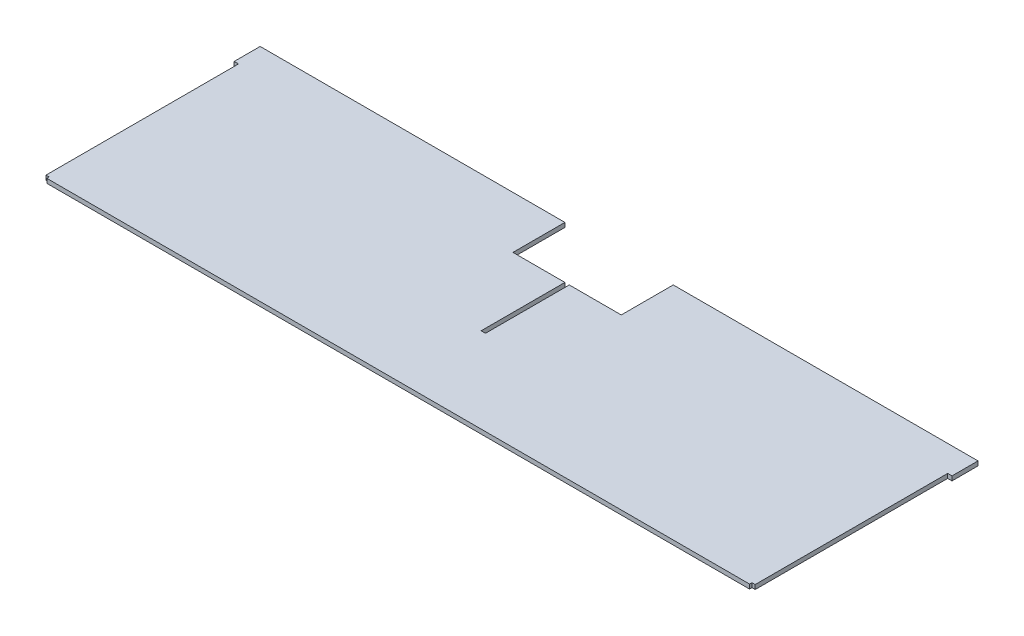
ISO-10303-21;
HEADER;
FILE_DESCRIPTION(('STEP AP214'),'2;1');
FILE_NAME('part.step','',(''),(''),'','','');
FILE_SCHEMA(('AUTOMOTIVE_DESIGN { 1 0 10303 214 1 1 1 1 }'));
ENDSEC;
DATA;
#1=APPLICATION_CONTEXT('core data for automotive mechanical design processes');
#2=APPLICATION_PROTOCOL_DEFINITION('international standard','automotive_design',2000,#1);
#3=PRODUCT_CONTEXT('',#1,'mechanical');
#4=PRODUCT('Part','Part','',(#3));
#5=PRODUCT_RELATED_PRODUCT_CATEGORY('part','',(#4));
#6=PRODUCT_DEFINITION_FORMATION('','',#4);
#7=PRODUCT_DEFINITION_CONTEXT('part definition',#1,'design');
#8=PRODUCT_DEFINITION('design','',#6,#7);
#9=PRODUCT_DEFINITION_SHAPE('','',#8);
#10=(LENGTH_UNIT() NAMED_UNIT(*) SI_UNIT(.MILLI.,.METRE.));
#11=(NAMED_UNIT(*) PLANE_ANGLE_UNIT() SI_UNIT($,.RADIAN.));
#12=(NAMED_UNIT(*) SI_UNIT($,.STERADIAN.) SOLID_ANGLE_UNIT());
#13=UNCERTAINTY_MEASURE_WITH_UNIT(LENGTH_MEASURE(1.E-05),#10,'distance_accuracy_value','');
#14=(GEOMETRIC_REPRESENTATION_CONTEXT(3) GLOBAL_UNCERTAINTY_ASSIGNED_CONTEXT((#13)) GLOBAL_UNIT_ASSIGNED_CONTEXT((#10,
#11,#12)) REPRESENTATION_CONTEXT('',''));
#15=CARTESIAN_POINT('',(0.,0.,0.));
#16=DIRECTION('',(0.,0.,1.));
#17=DIRECTION('',(1.,0.,0.));
#18=AXIS2_PLACEMENT_3D('',#15,#16,#17);
#19=CARTESIAN_POINT('',(-260.999093317,3.2,-99.5000000089999));
#20=DIRECTION('',(0.,0.,1.));
#21=DIRECTION('',(-1.,0.,0.));
#22=AXIS2_PLACEMENT_3D('',#19,#20,#21);
#23=PLANE('',#22);
#24=DIRECTION('',(0.,1.,0.));
#25=VECTOR('',#24,1.);
#26=CARTESIAN_POINT('',(41.7806399840001,0.,-99.500000009));
#27=LINE('',#26,#25);
#28=CARTESIAN_POINT('',(41.7806399840001,0.,-99.500000009));
#29=VERTEX_POINT('',#28);
#30=CARTESIAN_POINT('',(41.7806399840001,3.2,-99.500000009));
#31=VERTEX_POINT('',#30);
#32=EDGE_CURVE('E308',#29,#31,#27,.T.);
#33=ORIENTED_EDGE('',*,*,#32,.T.);
#34=DIRECTION('',(-1.,0.,0.));
#35=VECTOR('',#34,1.);
#36=CARTESIAN_POINT('',(-260.999093317,3.2,-99.5000000089999));
#37=LINE('',#36,#35);
#38=CARTESIAN_POINT('',(265.160373285,3.2,-99.500000009));
#39=VERTEX_POINT('',#38);
#40=EDGE_CURVE('E271',#39,#31,#37,.T.);
#41=ORIENTED_EDGE('',*,*,#40,.F.);
#42=DIRECTION('',(0.,1.,0.));
#43=VECTOR('',#42,1.);
#44=CARTESIAN_POINT('',(265.160373285,3.2,-99.500000009));
#45=LINE('',#44,#43);
#46=CARTESIAN_POINT('',(265.160373285,0.,-99.500000009));
#47=VERTEX_POINT('',#46);
#48=EDGE_CURVE('E220',#47,#39,#45,.T.);
#49=ORIENTED_EDGE('',*,*,#48,.F.);
#50=DIRECTION('',(1.,0.,0.));
#51=VECTOR('',#50,1.);
#52=CARTESIAN_POINT('',(0.,0.,-99.500000009));
#53=LINE('',#52,#51);
#54=EDGE_CURVE('E210',#47,#29,#53,.F.);
#55=ORIENTED_EDGE('',*,*,#54,.T.);
#56=EDGE_LOOP('',(#33,#41,#49,#55));
#57=FACE_BOUND('',#56,.T.);
#58=ADVANCED_FACE('F45',(#57),#23,.F.);
#59=CARTESIAN_POINT('',(-260.999093317,3.2,60.6376266290001));
#60=DIRECTION('',(1.,0.,0.));
#61=DIRECTION('',(0.,0.,1.));
#62=AXIS2_PLACEMENT_3D('',#59,#60,#61);
#63=PLANE('',#62);
#64=DIRECTION('',(0.,1.,0.));
#65=VECTOR('',#64,1.);
#66=CARTESIAN_POINT('',(-260.999093317,0.,-80.452540009));
#67=LINE('',#66,#65);
#68=CARTESIAN_POINT('',(-260.999093317,0.,-80.452540009));
#69=VERTEX_POINT('',#68);
#70=CARTESIAN_POINT('',(-260.999093317,3.2,-80.452540009));
#71=VERTEX_POINT('',#70);
#72=EDGE_CURVE('E312',#69,#71,#67,.T.);
#73=ORIENTED_EDGE('',*,*,#72,.T.);
#74=DIRECTION('',(0.,0.,1.));
#75=VECTOR('',#74,1.);
#76=CARTESIAN_POINT('',(-260.999093317,3.2,60.6376266290001));
#77=LINE('',#76,#75);
#78=CARTESIAN_POINT('',(-260.999093317,3.2,-99.5000000089999));
#79=VERTEX_POINT('',#78);
#80=EDGE_CURVE('E266',#79,#71,#77,.T.);
#81=ORIENTED_EDGE('',*,*,#80,.F.);
#82=DIRECTION('',(0.,1.,0.));
#83=VECTOR('',#82,1.);
#84=CARTESIAN_POINT('',(-260.999093317,3.2,-99.5000000089999));
#85=LINE('',#84,#83);
#86=CARTESIAN_POINT('',(-260.999093317,0.,-99.5000000089999));
#87=VERTEX_POINT('',#86);
#88=EDGE_CURVE('E53',#87,#79,#85,.T.);
#89=ORIENTED_EDGE('',*,*,#88,.F.);
#90=DIRECTION('',(0.,0.,-1.));
#91=VECTOR('',#90,1.);
#92=CARTESIAN_POINT('',(-260.999093317,0.,0.));
#93=LINE('',#92,#91);
#94=EDGE_CURVE('E205',#87,#69,#93,.F.);
#95=ORIENTED_EDGE('',*,*,#94,.T.);
#96=EDGE_LOOP('',(#73,#81,#89,#95));
#97=FACE_BOUND('',#96,.T.);
#98=ADVANCED_FACE('F357',(#97),#63,.F.);
#99=CARTESIAN_POINT('',(-260.999093317,3.2,60.6376266290001));
#100=DIRECTION('',(0.,0.,-1.));
#101=DIRECTION('',(1.,0.,0.));
#102=AXIS2_PLACEMENT_3D('',#99,#100,#101);
#103=PLANE('',#102);
#104=DIRECTION('',(0.,1.,0.));
#105=VECTOR('',#104,1.);
#106=CARTESIAN_POINT('',(-257.824093317,0.,60.6376266290001));
#107=LINE('',#106,#105);
#108=CARTESIAN_POINT('',(-257.824093317,0.,60.6376266290001));
#109=VERTEX_POINT('',#108);
#110=CARTESIAN_POINT('',(-257.824093317,3.2,60.6376266290001));
#111=VERTEX_POINT('',#110);
#112=EDGE_CURVE('E185',#109,#111,#107,.T.);
#113=ORIENTED_EDGE('',*,*,#112,.F.);
#114=DIRECTION('',(1.,0.,0.));
#115=VECTOR('',#114,1.);
#116=CARTESIAN_POINT('',(0.,0.,60.6376266290001));
#117=LINE('',#116,#115);
#118=CARTESIAN_POINT('',(-255.462493265,0.,60.6376266290001));
#119=VERTEX_POINT('',#118);
#120=EDGE_CURVE('E196',#109,#119,#117,.T.);
#121=ORIENTED_EDGE('',*,*,#120,.T.);
#122=DIRECTION('',(0.,1.,0.));
#123=VECTOR('',#122,1.);
#124=CARTESIAN_POINT('',(-255.462493265,3.2,60.6376266290001));
#125=LINE('',#124,#123);
#126=CARTESIAN_POINT('',(-255.462493265,3.2,60.6376266290001));
#127=VERTEX_POINT('',#126);
#128=EDGE_CURVE('E224',#119,#127,#125,.T.);
#129=ORIENTED_EDGE('',*,*,#128,.T.);
#130=DIRECTION('',(1.,0.,0.));
#131=VECTOR('',#130,1.);
#132=CARTESIAN_POINT('',(-260.999093317,3.2,60.6376266290001));
#133=LINE('',#132,#131);
#134=EDGE_CURVE('E198',#111,#127,#133,.T.);
#135=ORIENTED_EDGE('',*,*,#134,.F.);
#136=EDGE_LOOP('',(#113,#121,#129,#135));
#137=FACE_BOUND('',#136,.T.);
#138=ADVANCED_FACE('F194',(#137),#103,.F.);
#139=CARTESIAN_POINT('',(-255.462493265,3.2,60.6376266290001));
#140=DIRECTION('',(1.,0.,0.));
#141=DIRECTION('',(0.,0.,1.));
#142=AXIS2_PLACEMENT_3D('',#139,#140,#141);
#143=PLANE('',#142);
#144=ORIENTED_EDGE('',*,*,#128,.F.);
#145=DIRECTION('',(0.,0.,-1.));
#146=VECTOR('',#145,1.);
#147=CARTESIAN_POINT('',(-255.462493265,0.,0.));
#148=LINE('',#147,#146);
#149=CARTESIAN_POINT('',(-255.462493265,0.,62.4000000410001));
#150=VERTEX_POINT('',#149);
#151=EDGE_CURVE('E204',#119,#150,#148,.F.);
#152=ORIENTED_EDGE('',*,*,#151,.T.);
#153=DIRECTION('',(0.,1.,0.));
#154=VECTOR('',#153,1.);
#155=CARTESIAN_POINT('',(-255.462493265,3.2,62.4000000410001));
#156=LINE('',#155,#154);
#157=CARTESIAN_POINT('',(-255.462493265,3.2,62.4000000410001));
#158=VERTEX_POINT('',#157);
#159=EDGE_CURVE('E222',#150,#158,#156,.T.);
#160=ORIENTED_EDGE('',*,*,#159,.T.);
#161=DIRECTION('',(0.,0.,1.));
#162=VECTOR('',#161,1.);
#163=CARTESIAN_POINT('',(-255.462493265,3.2,60.6376266290001));
#164=LINE('',#163,#162);
#165=EDGE_CURVE('E264',#127,#158,#164,.T.);
#166=ORIENTED_EDGE('',*,*,#165,.F.);
#167=EDGE_LOOP('',(#144,#152,#160,#166));
#168=FACE_BOUND('',#167,.T.);
#169=ADVANCED_FACE('F261',(#168),#143,.F.);
#170=CARTESIAN_POINT('',(-255.462493265,3.2,62.4000000410001));
#171=DIRECTION('',(0.,0.,-1.));
#172=DIRECTION('',(1.,0.,0.));
#173=AXIS2_PLACEMENT_3D('',#170,#171,#172);
#174=PLANE('',#173);
#175=ORIENTED_EDGE('',*,*,#159,.F.);
#176=DIRECTION('',(1.,0.,0.));
#177=VECTOR('',#176,1.);
#178=CARTESIAN_POINT('',(0.,0.,62.4000000410001));
#179=LINE('',#178,#177);
#180=CARTESIAN_POINT('',(259.623773233,0.,62.400000041));
#181=VERTEX_POINT('',#180);
#182=EDGE_CURVE('E207',#150,#181,#179,.T.);
#183=ORIENTED_EDGE('',*,*,#182,.T.);
#184=DIRECTION('',(0.,1.,0.));
#185=VECTOR('',#184,1.);
#186=CARTESIAN_POINT('',(259.623773233,3.2,62.400000041));
#187=LINE('',#186,#185);
#188=CARTESIAN_POINT('',(259.623773233,3.2,62.400000041));
#189=VERTEX_POINT('',#188);
#190=EDGE_CURVE('E219',#181,#189,#187,.T.);
#191=ORIENTED_EDGE('',*,*,#190,.T.);
#192=DIRECTION('',(1.,0.,0.));
#193=VECTOR('',#192,1.);
#194=CARTESIAN_POINT('',(-255.462493265,3.2,62.4000000410001));
#195=LINE('',#194,#193);
#196=EDGE_CURVE('E240',#158,#189,#195,.T.);
#197=ORIENTED_EDGE('',*,*,#196,.F.);
#198=EDGE_LOOP('',(#175,#183,#191,#197));
#199=FACE_BOUND('',#198,.T.);
#200=ADVANCED_FACE('F255',(#199),#174,.F.);
#201=CARTESIAN_POINT('',(259.623773233,3.2,60.637626629));
#202=DIRECTION('',(-1.,0.,0.));
#203=DIRECTION('',(0.,0.,-1.));
#204=AXIS2_PLACEMENT_3D('',#201,#202,#203);
#205=PLANE('',#204);
#206=ORIENTED_EDGE('',*,*,#190,.F.);
#207=DIRECTION('',(0.,0.,-1.));
#208=VECTOR('',#207,1.);
#209=CARTESIAN_POINT('',(259.623773233,0.,0.));
#210=LINE('',#209,#208);
#211=CARTESIAN_POINT('',(259.623773233,0.,60.637626629));
#212=VERTEX_POINT('',#211);
#213=EDGE_CURVE('E251',#181,#212,#210,.T.);
#214=ORIENTED_EDGE('',*,*,#213,.T.);
#215=DIRECTION('',(0.,1.,0.));
#216=VECTOR('',#215,1.);
#217=CARTESIAN_POINT('',(259.623773233,3.2,60.637626629));
#218=LINE('',#217,#216);
#219=CARTESIAN_POINT('',(259.623773233,3.2,60.637626629));
#220=VERTEX_POINT('',#219);
#221=EDGE_CURVE('E217',#212,#220,#218,.T.);
#222=ORIENTED_EDGE('',*,*,#221,.T.);
#223=DIRECTION('',(0.,0.,-1.));
#224=VECTOR('',#223,1.);
#225=CARTESIAN_POINT('',(259.623773233,3.2,60.637626629));
#226=LINE('',#225,#224);
#227=EDGE_CURVE('E234',#189,#220,#226,.T.);
#228=ORIENTED_EDGE('',*,*,#227,.F.);
#229=EDGE_LOOP('',(#206,#214,#222,#228));
#230=FACE_BOUND('',#229,.T.);
#231=ADVANCED_FACE('F403',(#230),#205,.F.);
#232=CARTESIAN_POINT('',(265.160373285,3.2,60.637626629));
#233=DIRECTION('',(0.,0.,-1.));
#234=DIRECTION('',(1.,0.,0.));
#235=AXIS2_PLACEMENT_3D('',#232,#233,#234);
#236=PLANE('',#235);
#237=DIRECTION('',(0.,1.,0.));
#238=VECTOR('',#237,1.);
#239=CARTESIAN_POINT('',(261.985373285,0.,60.637626629));
#240=LINE('',#239,#238);
#241=CARTESIAN_POINT('',(261.985373285,0.,60.637626629));
#242=VERTEX_POINT('',#241);
#243=CARTESIAN_POINT('',(261.985373285,3.2,60.637626629));
#244=VERTEX_POINT('',#243);
#245=EDGE_CURVE('E342',#242,#244,#240,.T.);
#246=ORIENTED_EDGE('',*,*,#245,.T.);
#247=DIRECTION('',(1.,0.,0.));
#248=VECTOR('',#247,1.);
#249=CARTESIAN_POINT('',(265.160373285,3.2,60.637626629));
#250=LINE('',#249,#248);
#251=EDGE_CURVE('E228',#220,#244,#250,.T.);
#252=ORIENTED_EDGE('',*,*,#251,.F.);
#253=ORIENTED_EDGE('',*,*,#221,.F.);
#254=DIRECTION('',(1.,0.,0.));
#255=VECTOR('',#254,1.);
#256=CARTESIAN_POINT('',(0.,0.,60.637626629));
#257=LINE('',#256,#255);
#258=EDGE_CURVE('E247',#212,#242,#257,.T.);
#259=ORIENTED_EDGE('',*,*,#258,.T.);
#260=EDGE_LOOP('',(#246,#252,#253,#259));
#261=FACE_BOUND('',#260,.T.);
#262=ADVANCED_FACE('F400',(#261),#236,.F.);
#263=CARTESIAN_POINT('',(265.160373285,3.2,60.637626629));
#264=DIRECTION('',(-1.,0.,0.));
#265=DIRECTION('',(0.,0.,-1.));
#266=AXIS2_PLACEMENT_3D('',#263,#264,#265);
#267=PLANE('',#266);
#268=DIRECTION('',(0.,1.,0.));
#269=VECTOR('',#268,1.);
#270=CARTESIAN_POINT('',(265.160373285,0.,-80.450254009));
#271=LINE('',#270,#269);
#272=CARTESIAN_POINT('',(265.160373285,0.,-80.450254009));
#273=VERTEX_POINT('',#272);
#274=CARTESIAN_POINT('',(265.160373285,3.2,-80.450254009));
#275=VERTEX_POINT('',#274);
#276=EDGE_CURVE('E336',#273,#275,#271,.T.);
#277=ORIENTED_EDGE('',*,*,#276,.F.);
#278=DIRECTION('',(0.,0.,-1.));
#279=VECTOR('',#278,1.);
#280=CARTESIAN_POINT('',(265.160373285,0.,0.));
#281=LINE('',#280,#279);
#282=EDGE_CURVE('E244',#273,#47,#281,.T.);
#283=ORIENTED_EDGE('',*,*,#282,.T.);
#284=ORIENTED_EDGE('',*,*,#48,.T.);
#285=DIRECTION('',(0.,0.,-1.));
#286=VECTOR('',#285,1.);
#287=CARTESIAN_POINT('',(265.160373285,3.2,60.637626629));
#288=LINE('',#287,#286);
#289=EDGE_CURVE('E250',#275,#39,#288,.T.);
#290=ORIENTED_EDGE('',*,*,#289,.F.);
#291=EDGE_LOOP('',(#277,#283,#284,#290));
#292=FACE_BOUND('',#291,.T.);
#293=ADVANCED_FACE('F394',(#292),#267,.F.);
#294=DIRECTION('',(0.,1.,0.));
#295=VECTOR('',#294,1.);
#296=CARTESIAN_POINT('',(-37.6193600159999,0.,-99.500000009));
#297=LINE('',#296,#295);
#298=CARTESIAN_POINT('',(-37.6193600159999,0.,-99.500000009));
#299=VERTEX_POINT('',#298);
#300=CARTESIAN_POINT('',(-37.6193600159999,3.2,-99.500000009));
#301=VERTEX_POINT('',#300);
#302=EDGE_CURVE('E315',#299,#301,#297,.T.);
#303=ORIENTED_EDGE('',*,*,#302,.F.);
#304=EDGE_CURVE('E216',#299,#87,#53,.F.);
#305=ORIENTED_EDGE('',*,*,#304,.T.);
#306=ORIENTED_EDGE('',*,*,#88,.T.);
#307=EDGE_CURVE('E274',#301,#79,#37,.T.);
#308=ORIENTED_EDGE('',*,*,#307,.F.);
#309=EDGE_LOOP('',(#303,#305,#306,#308));
#310=FACE_BOUND('',#309,.T.);
#311=ADVANCED_FACE('F47',(#310),#23,.F.);
#312=CARTESIAN_POINT('',(0.,3.2,0.));
#313=DIRECTION('',(0.,-1.,0.));
#314=DIRECTION('',(0.,0.,-1.));
#315=AXIS2_PLACEMENT_3D('',#312,#313,#314);
#316=PLANE('',#315);
#317=ORIENTED_EDGE('',*,*,#80,.T.);
#318=DIRECTION('',(-1.,0.,0.));
#319=VECTOR('',#318,1.);
#320=CARTESIAN_POINT('',(-260.999093317,3.2,-80.452540009));
#321=LINE('',#320,#319);
#322=CARTESIAN_POINT('',(-257.824093317,3.2,-80.452540009));
#323=VERTEX_POINT('',#322);
#324=EDGE_CURVE('E190',#323,#71,#321,.T.);
#325=ORIENTED_EDGE('',*,*,#324,.F.);
#326=DIRECTION('',(0.,0.,-1.));
#327=VECTOR('',#326,1.);
#328=CARTESIAN_POINT('',(-257.824093317,3.2,60.6376266290001));
#329=LINE('',#328,#327);
#330=EDGE_CURVE('E340',#111,#323,#329,.T.);
#331=ORIENTED_EDGE('',*,*,#330,.F.);
#332=ORIENTED_EDGE('',*,*,#134,.T.);
#333=ORIENTED_EDGE('',*,*,#165,.T.);
#334=ORIENTED_EDGE('',*,*,#196,.T.);
#335=ORIENTED_EDGE('',*,*,#227,.T.);
#336=ORIENTED_EDGE('',*,*,#251,.T.);
#337=DIRECTION('',(0.,0.,1.));
#338=VECTOR('',#337,1.);
#339=CARTESIAN_POINT('',(261.985373285,3.2,60.637626629));
#340=LINE('',#339,#338);
#341=CARTESIAN_POINT('',(261.985373285,3.2,-80.450254009));
#342=VERTEX_POINT('',#341);
#343=EDGE_CURVE('E334',#342,#244,#340,.T.);
#344=ORIENTED_EDGE('',*,*,#343,.F.);
#345=DIRECTION('',(-1.,0.,0.));
#346=VECTOR('',#345,1.);
#347=CARTESIAN_POINT('',(265.160373285,3.2,-80.450254009));
#348=LINE('',#347,#346);
#349=EDGE_CURVE('E337',#275,#342,#348,.T.);
#350=ORIENTED_EDGE('',*,*,#349,.F.);
#351=ORIENTED_EDGE('',*,*,#289,.T.);
#352=ORIENTED_EDGE('',*,*,#40,.T.);
#353=DIRECTION('',(0.,0.,-1.));
#354=VECTOR('',#353,1.);
#355=CARTESIAN_POINT('',(41.7806399840001,3.2,-99.500000009));
#356=LINE('',#355,#354);
#357=CARTESIAN_POINT('',(41.7806399840001,3.2,-61.400000009));
#358=VERTEX_POINT('',#357);
#359=EDGE_CURVE('E298',#358,#31,#356,.T.);
#360=ORIENTED_EDGE('',*,*,#359,.F.);
#361=DIRECTION('',(1.,0.,0.));
#362=VECTOR('',#361,1.);
#363=CARTESIAN_POINT('',(3.6806399840001,3.2,-61.400000009));
#364=LINE('',#363,#362);
#365=CARTESIAN_POINT('',(3.6806399840001,3.2,-61.400000009));
#366=VERTEX_POINT('',#365);
#367=EDGE_CURVE('E303',#366,#358,#364,.T.);
#368=ORIENTED_EDGE('',*,*,#367,.F.);
#369=DIRECTION('',(0.,0.,-1.));
#370=VECTOR('',#369,1.);
#371=CARTESIAN_POINT('',(3.68063998400009,3.2,-199.000000018));
#372=LINE('',#371,#370);
#373=CARTESIAN_POINT('',(3.68063998400011,3.2,0.));
#374=VERTEX_POINT('',#373);
#375=EDGE_CURVE('E287',#374,#366,#372,.T.);
#376=ORIENTED_EDGE('',*,*,#375,.F.);
#377=DIRECTION('',(1.,0.,0.));
#378=VECTOR('',#377,1.);
#379=CARTESIAN_POINT('',(0.48063998400011,3.2,0.));
#380=LINE('',#379,#378);
#381=CARTESIAN_POINT('',(0.48063998400011,3.2,0.));
#382=VERTEX_POINT('',#381);
#383=EDGE_CURVE('E281',#382,#374,#380,.T.);
#384=ORIENTED_EDGE('',*,*,#383,.F.);
#385=DIRECTION('',(0.,0.,1.));
#386=VECTOR('',#385,1.);
#387=CARTESIAN_POINT('',(0.480639984000086,3.2,-199.000000018));
#388=LINE('',#387,#386);
#389=CARTESIAN_POINT('',(0.480639984000103,3.2,-61.400000009));
#390=VERTEX_POINT('',#389);
#391=EDGE_CURVE('E285',#390,#382,#388,.T.);
#392=ORIENTED_EDGE('',*,*,#391,.F.);
#393=DIRECTION('',(1.,0.,0.));
#394=VECTOR('',#393,1.);
#395=CARTESIAN_POINT('',(0.480639984000103,3.2,-61.400000009));
#396=LINE('',#395,#394);
#397=CARTESIAN_POINT('',(-37.6193600159999,3.2,-61.400000009));
#398=VERTEX_POINT('',#397);
#399=EDGE_CURVE('E322',#398,#390,#396,.T.);
#400=ORIENTED_EDGE('',*,*,#399,.F.);
#401=DIRECTION('',(0.,0.,1.));
#402=VECTOR('',#401,1.);
#403=CARTESIAN_POINT('',(-37.6193600159999,3.2,-99.500000009));
#404=LINE('',#403,#402);
#405=EDGE_CURVE('E306',#301,#398,#404,.T.);
#406=ORIENTED_EDGE('',*,*,#405,.F.);
#407=ORIENTED_EDGE('',*,*,#307,.T.);
#408=EDGE_LOOP('',(#317,#325,#331,#332,#333,#334,#335,#336,#344,#350,#351,#352,#360,#368,#376,
#384,#392,#400,#406,#407));
#409=FACE_BOUND('',#408,.T.);
#410=ADVANCED_FACE('F375',(#409),#316,.F.);
#411=CARTESIAN_POINT('',(0.,0.,0.));
#412=DIRECTION('',(0.,-1.,0.));
#413=DIRECTION('',(0.,0.,-1.));
#414=AXIS2_PLACEMENT_3D('',#411,#412,#413);
#415=PLANE('',#414);
#416=DIRECTION('',(-1.,0.,0.));
#417=VECTOR('',#416,1.);
#418=CARTESIAN_POINT('',(-260.999093317,0.,-80.452540009));
#419=LINE('',#418,#417);
#420=CARTESIAN_POINT('',(-257.824093317,0.,-80.452540009));
#421=VERTEX_POINT('',#420);
#422=EDGE_CURVE('E60',#421,#69,#419,.T.);
#423=ORIENTED_EDGE('',*,*,#422,.T.);
#424=ORIENTED_EDGE('',*,*,#94,.F.);
#425=ORIENTED_EDGE('',*,*,#304,.F.);
#426=DIRECTION('',(0.,0.,1.));
#427=VECTOR('',#426,1.);
#428=CARTESIAN_POINT('',(-37.6193600159999,0.,-99.500000009));
#429=LINE('',#428,#427);
#430=CARTESIAN_POINT('',(-37.6193600159999,0.,-61.400000009));
#431=VERTEX_POINT('',#430);
#432=EDGE_CURVE('E324',#299,#431,#429,.T.);
#433=ORIENTED_EDGE('',*,*,#432,.T.);
#434=DIRECTION('',(1.,0.,0.));
#435=VECTOR('',#434,1.);
#436=CARTESIAN_POINT('',(0.480639984000103,0.,-61.400000009));
#437=LINE('',#436,#435);
#438=CARTESIAN_POINT('',(0.480639984000103,0.,-61.400000009));
#439=VERTEX_POINT('',#438);
#440=EDGE_CURVE('E318',#431,#439,#437,.T.);
#441=ORIENTED_EDGE('',*,*,#440,.T.);
#442=DIRECTION('',(0.,0.,-1.));
#443=VECTOR('',#442,1.);
#444=CARTESIAN_POINT('',(0.48063998400011,0.,0.));
#445=LINE('',#444,#443);
#446=CARTESIAN_POINT('',(0.48063998400011,0.,0.));
#447=VERTEX_POINT('',#446);
#448=EDGE_CURVE('E11',#447,#439,#445,.T.);
#449=ORIENTED_EDGE('',*,*,#448,.F.);
#450=DIRECTION('',(1.,0.,0.));
#451=VECTOR('',#450,1.);
#452=CARTESIAN_POINT('',(0.48063998400011,0.,0.));
#453=LINE('',#452,#451);
#454=CARTESIAN_POINT('',(3.68063998400011,0.,0.));
#455=VERTEX_POINT('',#454);
#456=EDGE_CURVE('E279',#447,#455,#453,.T.);
#457=ORIENTED_EDGE('',*,*,#456,.T.);
#458=DIRECTION('',(0.,0.,-1.));
#459=VECTOR('',#458,1.);
#460=CARTESIAN_POINT('',(3.68063998400009,0.,-199.000000018));
#461=LINE('',#460,#459);
#462=CARTESIAN_POINT('',(3.6806399840001,0.,-61.400000009));
#463=VERTEX_POINT('',#462);
#464=EDGE_CURVE('E284',#455,#463,#461,.T.);
#465=ORIENTED_EDGE('',*,*,#464,.T.);
#466=DIRECTION('',(1.,0.,0.));
#467=VECTOR('',#466,1.);
#468=CARTESIAN_POINT('',(3.6806399840001,0.,-61.400000009));
#469=LINE('',#468,#467);
#470=CARTESIAN_POINT('',(41.7806399840001,0.,-61.400000009));
#471=VERTEX_POINT('',#470);
#472=EDGE_CURVE('E295',#463,#471,#469,.T.);
#473=ORIENTED_EDGE('',*,*,#472,.T.);
#474=DIRECTION('',(0.,0.,-1.));
#475=VECTOR('',#474,1.);
#476=CARTESIAN_POINT('',(41.7806399840001,0.,-99.500000009));
#477=LINE('',#476,#475);
#478=EDGE_CURVE('E299',#471,#29,#477,.T.);
#479=ORIENTED_EDGE('',*,*,#478,.T.);
#480=ORIENTED_EDGE('',*,*,#54,.F.);
#481=ORIENTED_EDGE('',*,*,#282,.F.);
#482=DIRECTION('',(-1.,0.,0.));
#483=VECTOR('',#482,1.);
#484=CARTESIAN_POINT('',(265.160373285,0.,-80.450254009));
#485=LINE('',#484,#483);
#486=CARTESIAN_POINT('',(261.985373285,0.,-80.450254009));
#487=VERTEX_POINT('',#486);
#488=EDGE_CURVE('E331',#273,#487,#485,.T.);
#489=ORIENTED_EDGE('',*,*,#488,.T.);
#490=DIRECTION('',(0.,0.,1.));
#491=VECTOR('',#490,1.);
#492=CARTESIAN_POINT('',(261.985373285,0.,60.637626629));
#493=LINE('',#492,#491);
#494=EDGE_CURVE('E68',#487,#242,#493,.T.);
#495=ORIENTED_EDGE('',*,*,#494,.T.);
#496=ORIENTED_EDGE('',*,*,#258,.F.);
#497=ORIENTED_EDGE('',*,*,#213,.F.);
#498=ORIENTED_EDGE('',*,*,#182,.F.);
#499=ORIENTED_EDGE('',*,*,#151,.F.);
#500=ORIENTED_EDGE('',*,*,#120,.F.);
#501=DIRECTION('',(0.,0.,-1.));
#502=VECTOR('',#501,1.);
#503=CARTESIAN_POINT('',(-257.824093317,0.,60.6376266290001));
#504=LINE('',#503,#502);
#505=EDGE_CURVE('E181',#109,#421,#504,.T.);
#506=ORIENTED_EDGE('',*,*,#505,.T.);
#507=EDGE_LOOP('',(#423,#424,#425,#433,#441,#449,#457,#465,#473,#479,#480,#481,#489,#495,#496,
#497,#498,#499,#500,#506));
#508=FACE_BOUND('',#507,.T.);
#509=ADVANCED_FACE('F201',(#508),#415,.T.);
#510=CARTESIAN_POINT('',(3.68063998400009,0.,-199.000000018));
#511=DIRECTION('',(1.,0.,0.));
#512=DIRECTION('',(0.,0.,-1.));
#513=AXIS2_PLACEMENT_3D('',#510,#511,#512);
#514=PLANE('',#513);
#515=ORIENTED_EDGE('',*,*,#375,.T.);
#516=DIRECTION('',(0.,1.,0.));
#517=VECTOR('',#516,1.);
#518=CARTESIAN_POINT('',(3.6806399840001,0.,-61.400000009));
#519=LINE('',#518,#517);
#520=EDGE_CURVE('E302',#463,#366,#519,.T.);
#521=ORIENTED_EDGE('',*,*,#520,.F.);
#522=ORIENTED_EDGE('',*,*,#464,.F.);
#523=DIRECTION('',(0.,1.,0.));
#524=VECTOR('',#523,1.);
#525=CARTESIAN_POINT('',(3.68063998400011,0.,0.));
#526=LINE('',#525,#524);
#527=EDGE_CURVE('E246',#455,#374,#526,.T.);
#528=ORIENTED_EDGE('',*,*,#527,.T.);
#529=EDGE_LOOP('',(#515,#521,#522,#528));
#530=FACE_BOUND('',#529,.T.);
#531=ADVANCED_FACE('F383',(#530),#514,.F.);
#532=CARTESIAN_POINT('',(0.48063998400011,0.,0.));
#533=DIRECTION('',(0.,0.,1.));
#534=DIRECTION('',(1.,0.,0.));
#535=AXIS2_PLACEMENT_3D('',#532,#533,#534);
#536=PLANE('',#535);
#537=ORIENTED_EDGE('',*,*,#383,.T.);
#538=ORIENTED_EDGE('',*,*,#527,.F.);
#539=ORIENTED_EDGE('',*,*,#456,.F.);
#540=DIRECTION('',(0.,1.,0.));
#541=VECTOR('',#540,1.);
#542=CARTESIAN_POINT('',(0.48063998400011,0.,0.));
#543=LINE('',#542,#541);
#544=EDGE_CURVE('E276',#447,#382,#543,.T.);
#545=ORIENTED_EDGE('',*,*,#544,.T.);
#546=EDGE_LOOP('',(#537,#538,#539,#545));
#547=FACE_BOUND('',#546,.T.);
#548=ADVANCED_FACE('F379',(#547),#536,.F.);
#549=CARTESIAN_POINT('',(0.480639984000086,0.,-199.000000018));
#550=DIRECTION('',(-1.,0.,0.));
#551=DIRECTION('',(0.,0.,1.));
#552=AXIS2_PLACEMENT_3D('',#549,#550,#551);
#553=PLANE('',#552);
#554=ORIENTED_EDGE('',*,*,#448,.T.);
#555=DIRECTION('',(0.,1.,0.));
#556=VECTOR('',#555,1.);
#557=CARTESIAN_POINT('',(0.480639984000103,0.,-61.400000009));
#558=LINE('',#557,#556);
#559=EDGE_CURVE('E290',#439,#390,#558,.T.);
#560=ORIENTED_EDGE('',*,*,#559,.T.);
#561=ORIENTED_EDGE('',*,*,#391,.T.);
#562=ORIENTED_EDGE('',*,*,#544,.F.);
#563=EDGE_LOOP('',(#554,#560,#561,#562));
#564=FACE_BOUND('',#563,.T.);
#565=ADVANCED_FACE('F372',(#564),#553,.F.);
#566=CARTESIAN_POINT('',(0.480639984000103,0.,-61.400000009));
#567=DIRECTION('',(0.,0.,1.));
#568=DIRECTION('',(1.,0.,0.));
#569=AXIS2_PLACEMENT_3D('',#566,#567,#568);
#570=PLANE('',#569);
#571=ORIENTED_EDGE('',*,*,#399,.T.);
#572=ORIENTED_EDGE('',*,*,#559,.F.);
#573=ORIENTED_EDGE('',*,*,#440,.F.);
#574=DIRECTION('',(0.,1.,0.));
#575=VECTOR('',#574,1.);
#576=CARTESIAN_POINT('',(-37.6193600159999,0.,-61.400000009));
#577=LINE('',#576,#575);
#578=EDGE_CURVE('E317',#431,#398,#577,.T.);
#579=ORIENTED_EDGE('',*,*,#578,.T.);
#580=EDGE_LOOP('',(#571,#572,#573,#579));
#581=FACE_BOUND('',#580,.T.);
#582=ADVANCED_FACE('F369',(#581),#570,.F.);
#583=CARTESIAN_POINT('',(-37.6193600159999,0.,-99.500000009));
#584=DIRECTION('',(-1.,0.,0.));
#585=DIRECTION('',(0.,0.,1.));
#586=AXIS2_PLACEMENT_3D('',#583,#584,#585);
#587=PLANE('',#586);
#588=ORIENTED_EDGE('',*,*,#405,.T.);
#589=ORIENTED_EDGE('',*,*,#578,.F.);
#590=ORIENTED_EDGE('',*,*,#432,.F.);
#591=ORIENTED_EDGE('',*,*,#302,.T.);
#592=EDGE_LOOP('',(#588,#589,#590,#591));
#593=FACE_BOUND('',#592,.T.);
#594=ADVANCED_FACE('F365',(#593),#587,.F.);
#595=CARTESIAN_POINT('',(41.7806399840001,0.,-99.500000009));
#596=DIRECTION('',(1.,0.,0.));
#597=DIRECTION('',(0.,0.,-1.));
#598=AXIS2_PLACEMENT_3D('',#595,#596,#597);
#599=PLANE('',#598);
#600=ORIENTED_EDGE('',*,*,#359,.T.);
#601=ORIENTED_EDGE('',*,*,#32,.F.);
#602=ORIENTED_EDGE('',*,*,#478,.F.);
#603=DIRECTION('',(0.,1.,0.));
#604=VECTOR('',#603,1.);
#605=CARTESIAN_POINT('',(41.7806399840001,0.,-61.400000009));
#606=LINE('',#605,#604);
#607=EDGE_CURVE('E311',#471,#358,#606,.T.);
#608=ORIENTED_EDGE('',*,*,#607,.T.);
#609=EDGE_LOOP('',(#600,#601,#602,#608));
#610=FACE_BOUND('',#609,.T.);
#611=ADVANCED_FACE('F388',(#610),#599,.F.);
#612=CARTESIAN_POINT('',(3.6806399840001,0.,-61.400000009));
#613=DIRECTION('',(0.,0.,1.));
#614=DIRECTION('',(1.,0.,0.));
#615=AXIS2_PLACEMENT_3D('',#612,#613,#614);
#616=PLANE('',#615);
#617=ORIENTED_EDGE('',*,*,#367,.T.);
#618=ORIENTED_EDGE('',*,*,#607,.F.);
#619=ORIENTED_EDGE('',*,*,#472,.F.);
#620=ORIENTED_EDGE('',*,*,#520,.T.);
#621=EDGE_LOOP('',(#617,#618,#619,#620));
#622=FACE_BOUND('',#621,.T.);
#623=ADVANCED_FACE('F385',(#622),#616,.F.);
#624=CARTESIAN_POINT('',(261.985373285,0.,60.637626629));
#625=DIRECTION('',(-1.,0.,0.));
#626=DIRECTION('',(0.,0.,1.));
#627=AXIS2_PLACEMENT_3D('',#624,#625,#626);
#628=PLANE('',#627);
#629=ORIENTED_EDGE('',*,*,#343,.T.);
#630=ORIENTED_EDGE('',*,*,#245,.F.);
#631=ORIENTED_EDGE('',*,*,#494,.F.);
#632=DIRECTION('',(0.,1.,0.));
#633=VECTOR('',#632,1.);
#634=CARTESIAN_POINT('',(261.985373285,0.,-80.450254009));
#635=LINE('',#634,#633);
#636=EDGE_CURVE('E345',#487,#342,#635,.T.);
#637=ORIENTED_EDGE('',*,*,#636,.T.);
#638=EDGE_LOOP('',(#629,#630,#631,#637));
#639=FACE_BOUND('',#638,.T.);
#640=ADVANCED_FACE('F398',(#639),#628,.F.);
#641=CARTESIAN_POINT('',(265.160373285,0.,-80.450254009));
#642=DIRECTION('',(0.,0.,-1.));
#643=DIRECTION('',(-1.,0.,0.));
#644=AXIS2_PLACEMENT_3D('',#641,#642,#643);
#645=PLANE('',#644);
#646=ORIENTED_EDGE('',*,*,#349,.T.);
#647=ORIENTED_EDGE('',*,*,#636,.F.);
#648=ORIENTED_EDGE('',*,*,#488,.F.);
#649=ORIENTED_EDGE('',*,*,#276,.T.);
#650=EDGE_LOOP('',(#646,#647,#648,#649));
#651=FACE_BOUND('',#650,.T.);
#652=ADVANCED_FACE('F397',(#651),#645,.F.);
#653=CARTESIAN_POINT('',(-260.999093317,0.,-80.452540009));
#654=DIRECTION('',(0.,0.,-1.));
#655=DIRECTION('',(-1.,0.,0.));
#656=AXIS2_PLACEMENT_3D('',#653,#654,#655);
#657=PLANE('',#656);
#658=ORIENTED_EDGE('',*,*,#324,.T.);
#659=ORIENTED_EDGE('',*,*,#72,.F.);
#660=ORIENTED_EDGE('',*,*,#422,.F.);
#661=DIRECTION('',(0.,1.,0.));
#662=VECTOR('',#661,1.);
#663=CARTESIAN_POINT('',(-257.824093317,0.,-80.452540009));
#664=LINE('',#663,#662);
#665=EDGE_CURVE('E187',#421,#323,#664,.T.);
#666=ORIENTED_EDGE('',*,*,#665,.T.);
#667=EDGE_LOOP('',(#658,#659,#660,#666));
#668=FACE_BOUND('',#667,.T.);
#669=ADVANCED_FACE('F446',(#668),#657,.F.);
#670=CARTESIAN_POINT('',(-257.824093317,0.,60.6376266290001));
#671=DIRECTION('',(1.,0.,0.));
#672=DIRECTION('',(0.,0.,-1.));
#673=AXIS2_PLACEMENT_3D('',#670,#671,#672);
#674=PLANE('',#673);
#675=ORIENTED_EDGE('',*,*,#330,.T.);
#676=ORIENTED_EDGE('',*,*,#665,.F.);
#677=ORIENTED_EDGE('',*,*,#505,.F.);
#678=ORIENTED_EDGE('',*,*,#112,.T.);
#679=EDGE_LOOP('',(#675,#676,#677,#678));
#680=FACE_BOUND('',#679,.T.);
#681=ADVANCED_FACE('F184',(#680),#674,.F.);
#682=CLOSED_SHELL('',(#58,#98,#138,#169,#200,#231,#262,#293,#311,#410,#509,#531,#548,#565,#582,
#594,#611,#623,#640,#652,#669,#681));
#683=MANIFOLD_SOLID_BREP('B2',#682);
#684=ADVANCED_BREP_SHAPE_REPRESENTATION('',(#18,#683),#14);
#685=SHAPE_DEFINITION_REPRESENTATION(#9,#684);
ENDSEC;
END-ISO-10303-21;
